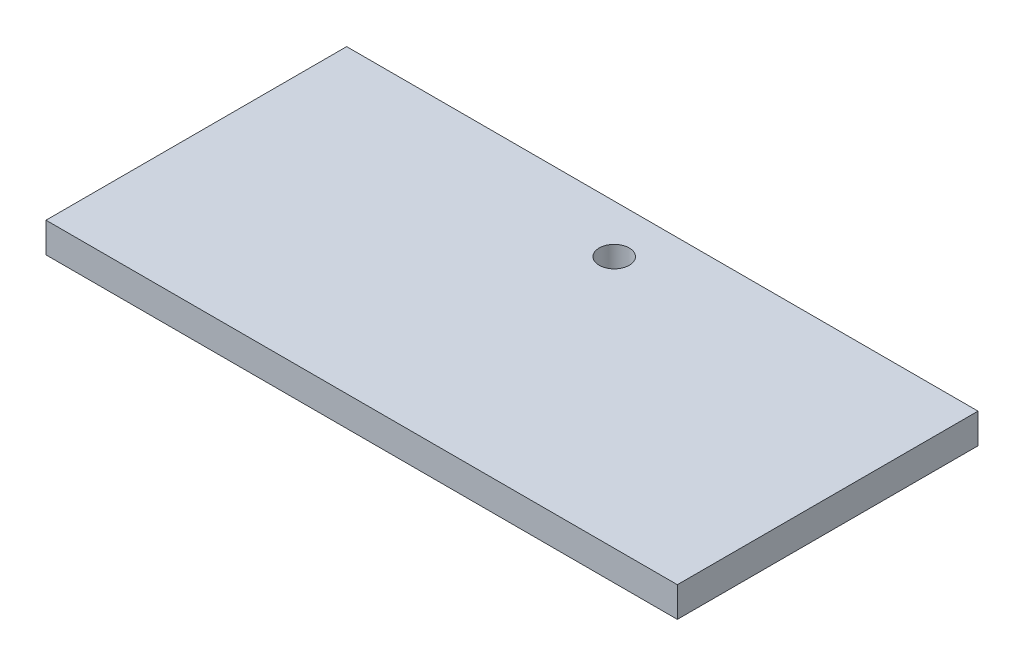
ISO-10303-21;
HEADER;
FILE_DESCRIPTION(('STEP AP214'),'2;1');
FILE_NAME('part.step','',(''),(''),'','','');
FILE_SCHEMA(('AUTOMOTIVE_DESIGN { 1 0 10303 214 1 1 1 1 }'));
ENDSEC;
DATA;
#1=APPLICATION_CONTEXT('core data for automotive mechanical design processes');
#2=APPLICATION_PROTOCOL_DEFINITION('international standard','automotive_design',2000,#1);
#3=PRODUCT_CONTEXT('',#1,'mechanical');
#4=PRODUCT('Part','Part','',(#3));
#5=PRODUCT_RELATED_PRODUCT_CATEGORY('part','',(#4));
#6=PRODUCT_DEFINITION_FORMATION('','',#4);
#7=PRODUCT_DEFINITION_CONTEXT('part definition',#1,'design');
#8=PRODUCT_DEFINITION('design','',#6,#7);
#9=PRODUCT_DEFINITION_SHAPE('','',#8);
#10=(LENGTH_UNIT() NAMED_UNIT(*) SI_UNIT(.MILLI.,.METRE.));
#11=(NAMED_UNIT(*) PLANE_ANGLE_UNIT() SI_UNIT($,.RADIAN.));
#12=(NAMED_UNIT(*) SI_UNIT($,.STERADIAN.) SOLID_ANGLE_UNIT());
#13=UNCERTAINTY_MEASURE_WITH_UNIT(LENGTH_MEASURE(1.E-05),#10,'distance_accuracy_value','');
#14=(GEOMETRIC_REPRESENTATION_CONTEXT(3) GLOBAL_UNCERTAINTY_ASSIGNED_CONTEXT((#13)) GLOBAL_UNIT_ASSIGNED_CONTEXT((#10,
#11,#12)) REPRESENTATION_CONTEXT('',''));
#15=CARTESIAN_POINT('',(0.,0.,0.));
#16=DIRECTION('',(0.,0.,1.));
#17=DIRECTION('',(1.,0.,0.));
#18=AXIS2_PLACEMENT_3D('',#15,#16,#17);
#19=CARTESIAN_POINT('',(0.,50.,0.));
#20=DIRECTION('',(0.,-1.,0.));
#21=DIRECTION('',(0.,0.,-1.));
#22=AXIS2_PLACEMENT_3D('',#19,#20,#21);
#23=PLANE('',#22);
#24=DIRECTION('',(0.,0.,1.));
#25=VECTOR('',#24,1.);
#26=CARTESIAN_POINT('',(0.,50.,0.));
#27=LINE('',#26,#25);
#28=CARTESIAN_POINT('',(0.,50.,-500.));
#29=VERTEX_POINT('',#28);
#30=CARTESIAN_POINT('',(0.,50.,0.));
#31=VERTEX_POINT('',#30);
#32=EDGE_CURVE('E96',#29,#31,#27,.T.);
#33=ORIENTED_EDGE('',*,*,#32,.T.);
#34=DIRECTION('',(1.,0.,0.));
#35=VECTOR('',#34,1.);
#36=CARTESIAN_POINT('',(0.,50.,0.));
#37=LINE('',#36,#35);
#38=CARTESIAN_POINT('',(1050.,50.,0.));
#39=VERTEX_POINT('',#38);
#40=EDGE_CURVE('E91',#31,#39,#37,.T.);
#41=ORIENTED_EDGE('',*,*,#40,.T.);
#42=DIRECTION('',(0.,0.,-1.));
#43=VECTOR('',#42,1.);
#44=CARTESIAN_POINT('',(1050.,50.,0.));
#45=LINE('',#44,#43);
#46=CARTESIAN_POINT('',(1050.,50.,-500.));
#47=VERTEX_POINT('',#46);
#48=EDGE_CURVE('E94',#39,#47,#45,.T.);
#49=ORIENTED_EDGE('',*,*,#48,.T.);
#50=DIRECTION('',(-1.,0.,0.));
#51=VECTOR('',#50,1.);
#52=CARTESIAN_POINT('',(0.,50.,-500.));
#53=LINE('',#52,#51);
#54=EDGE_CURVE('E61',#47,#29,#53,.T.);
#55=ORIENTED_EDGE('',*,*,#54,.T.);
#56=EDGE_LOOP('',(#33,#41,#49,#55));
#57=FACE_BOUND('',#56,.T.);
#58=CARTESIAN_POINT('',(525.,50.,-420.));
#59=DIRECTION('',(0.,1.,0.));
#60=DIRECTION('',(0.,0.,1.));
#61=AXIS2_PLACEMENT_3D('',#58,#59,#60);
#62=CIRCLE('',#61,25.);
#63=CARTESIAN_POINT('',(525.,50.,-395.));
#64=VERTEX_POINT('',#63);
#65=EDGE_CURVE('E116',#64,#64,#62,.T.);
#66=ORIENTED_EDGE('',*,*,#65,.F.);
#67=EDGE_LOOP('',(#66));
#68=FACE_BOUND('',#67,.T.);
#69=ADVANCED_FACE('F43',(#57,#68),#23,.F.);
#70=CARTESIAN_POINT('',(0.,0.,0.));
#71=DIRECTION('',(0.,-1.,0.));
#72=DIRECTION('',(0.,0.,-1.));
#73=AXIS2_PLACEMENT_3D('',#70,#71,#72);
#74=PLANE('',#73);
#75=DIRECTION('',(0.,0.,1.));
#76=VECTOR('',#75,1.);
#77=CARTESIAN_POINT('',(0.,0.,0.));
#78=LINE('',#77,#76);
#79=CARTESIAN_POINT('',(0.,0.,-500.));
#80=VERTEX_POINT('',#79);
#81=CARTESIAN_POINT('',(0.,0.,0.));
#82=VERTEX_POINT('',#81);
#83=EDGE_CURVE('E112',#80,#82,#78,.T.);
#84=ORIENTED_EDGE('',*,*,#83,.F.);
#85=DIRECTION('',(-1.,0.,0.));
#86=VECTOR('',#85,1.);
#87=CARTESIAN_POINT('',(0.,0.,-500.));
#88=LINE('',#87,#86);
#89=CARTESIAN_POINT('',(1050.,0.,-500.));
#90=VERTEX_POINT('',#89);
#91=EDGE_CURVE('E84',#90,#80,#88,.T.);
#92=ORIENTED_EDGE('',*,*,#91,.F.);
#93=DIRECTION('',(0.,0.,-1.));
#94=VECTOR('',#93,1.);
#95=CARTESIAN_POINT('',(1050.,0.,0.));
#96=LINE('',#95,#94);
#97=CARTESIAN_POINT('',(1050.,0.,0.));
#98=VERTEX_POINT('',#97);
#99=EDGE_CURVE('E78',#98,#90,#96,.T.);
#100=ORIENTED_EDGE('',*,*,#99,.F.);
#101=DIRECTION('',(1.,0.,0.));
#102=VECTOR('',#101,1.);
#103=CARTESIAN_POINT('',(0.,0.,0.));
#104=LINE('',#103,#102);
#105=EDGE_CURVE('E101',#82,#98,#104,.T.);
#106=ORIENTED_EDGE('',*,*,#105,.F.);
#107=EDGE_LOOP('',(#84,#92,#100,#106));
#108=FACE_BOUND('',#107,.T.);
#109=CARTESIAN_POINT('',(525.,0.,-420.));
#110=DIRECTION('',(0.,1.,0.));
#111=DIRECTION('',(0.,0.,1.));
#112=AXIS2_PLACEMENT_3D('',#109,#110,#111);
#113=CIRCLE('',#112,25.);
#114=CARTESIAN_POINT('',(525.,0.,-395.));
#115=VERTEX_POINT('',#114);
#116=EDGE_CURVE('E134',#115,#115,#113,.T.);
#117=ORIENTED_EDGE('',*,*,#116,.T.);
#118=EDGE_LOOP('',(#117));
#119=FACE_BOUND('',#118,.T.);
#120=ADVANCED_FACE('F129',(#108,#119),#74,.T.);
#121=CARTESIAN_POINT('',(0.,50.,0.));
#122=DIRECTION('',(1.,0.,0.));
#123=DIRECTION('',(0.,0.,-1.));
#124=AXIS2_PLACEMENT_3D('',#121,#122,#123);
#125=PLANE('',#124);
#126=ORIENTED_EDGE('',*,*,#83,.T.);
#127=DIRECTION('',(0.,-1.,0.));
#128=VECTOR('',#127,1.);
#129=CARTESIAN_POINT('',(0.,50.,0.));
#130=LINE('',#129,#128);
#131=EDGE_CURVE('E11',#31,#82,#130,.T.);
#132=ORIENTED_EDGE('',*,*,#131,.F.);
#133=ORIENTED_EDGE('',*,*,#32,.F.);
#134=DIRECTION('',(0.,-1.,0.));
#135=VECTOR('',#134,1.);
#136=CARTESIAN_POINT('',(0.,50.,-500.));
#137=LINE('',#136,#135);
#138=EDGE_CURVE('E108',#29,#80,#137,.T.);
#139=ORIENTED_EDGE('',*,*,#138,.T.);
#140=EDGE_LOOP('',(#126,#132,#133,#139));
#141=FACE_BOUND('',#140,.T.);
#142=ADVANCED_FACE('F45',(#141),#125,.F.);
#143=CARTESIAN_POINT('',(0.,50.,0.));
#144=DIRECTION('',(0.,0.,-1.));
#145=DIRECTION('',(-1.,0.,0.));
#146=AXIS2_PLACEMENT_3D('',#143,#144,#145);
#147=PLANE('',#146);
#148=ORIENTED_EDGE('',*,*,#105,.T.);
#149=DIRECTION('',(0.,-1.,0.));
#150=VECTOR('',#149,1.);
#151=CARTESIAN_POINT('',(1050.,50.,0.));
#152=LINE('',#151,#150);
#153=EDGE_CURVE('E53',#39,#98,#152,.T.);
#154=ORIENTED_EDGE('',*,*,#153,.F.);
#155=ORIENTED_EDGE('',*,*,#40,.F.);
#156=ORIENTED_EDGE('',*,*,#131,.T.);
#157=EDGE_LOOP('',(#148,#154,#155,#156));
#158=FACE_BOUND('',#157,.T.);
#159=ADVANCED_FACE('F100',(#158),#147,.F.);
#160=CARTESIAN_POINT('',(1050.,50.,0.));
#161=DIRECTION('',(-1.,0.,0.));
#162=DIRECTION('',(0.,0.,1.));
#163=AXIS2_PLACEMENT_3D('',#160,#161,#162);
#164=PLANE('',#163);
#165=ORIENTED_EDGE('',*,*,#99,.T.);
#166=DIRECTION('',(0.,-1.,0.));
#167=VECTOR('',#166,1.);
#168=CARTESIAN_POINT('',(1050.,50.,-500.));
#169=LINE('',#168,#167);
#170=EDGE_CURVE('E103',#47,#90,#169,.T.);
#171=ORIENTED_EDGE('',*,*,#170,.F.);
#172=ORIENTED_EDGE('',*,*,#48,.F.);
#173=ORIENTED_EDGE('',*,*,#153,.T.);
#174=EDGE_LOOP('',(#165,#171,#172,#173));
#175=FACE_BOUND('',#174,.T.);
#176=ADVANCED_FACE('F104',(#175),#164,.F.);
#177=CARTESIAN_POINT('',(0.,50.,-500.));
#178=DIRECTION('',(0.,0.,1.));
#179=DIRECTION('',(1.,0.,0.));
#180=AXIS2_PLACEMENT_3D('',#177,#178,#179);
#181=PLANE('',#180);
#182=ORIENTED_EDGE('',*,*,#91,.T.);
#183=ORIENTED_EDGE('',*,*,#138,.F.);
#184=ORIENTED_EDGE('',*,*,#54,.F.);
#185=ORIENTED_EDGE('',*,*,#170,.T.);
#186=EDGE_LOOP('',(#182,#183,#184,#185));
#187=FACE_BOUND('',#186,.T.);
#188=ADVANCED_FACE('F126',(#187),#181,.F.);
#189=CARTESIAN_POINT('',(525.,50.,-420.));
#190=DIRECTION('',(0.,-1.,0.));
#191=DIRECTION('',(0.,0.,-1.));
#192=AXIS2_PLACEMENT_3D('',#189,#190,#191);
#193=CYLINDRICAL_SURFACE('',#192,25.);
#194=ORIENTED_EDGE('',*,*,#65,.T.);
#195=EDGE_LOOP('',(#194));
#196=FACE_BOUND('',#195,.T.);
#197=ORIENTED_EDGE('',*,*,#116,.F.);
#198=EDGE_LOOP('',(#197));
#199=FACE_BOUND('',#198,.T.);
#200=ADVANCED_FACE('F142',(#196,#199),#193,.F.);
#201=CLOSED_SHELL('',(#69,#120,#142,#159,#176,#188,#200));
#202=MANIFOLD_SOLID_BREP('B2',#201);
#203=ADVANCED_BREP_SHAPE_REPRESENTATION('',(#18,#202),#14);
#204=SHAPE_DEFINITION_REPRESENTATION(#9,#203);
ENDSEC;
END-ISO-10303-21;
